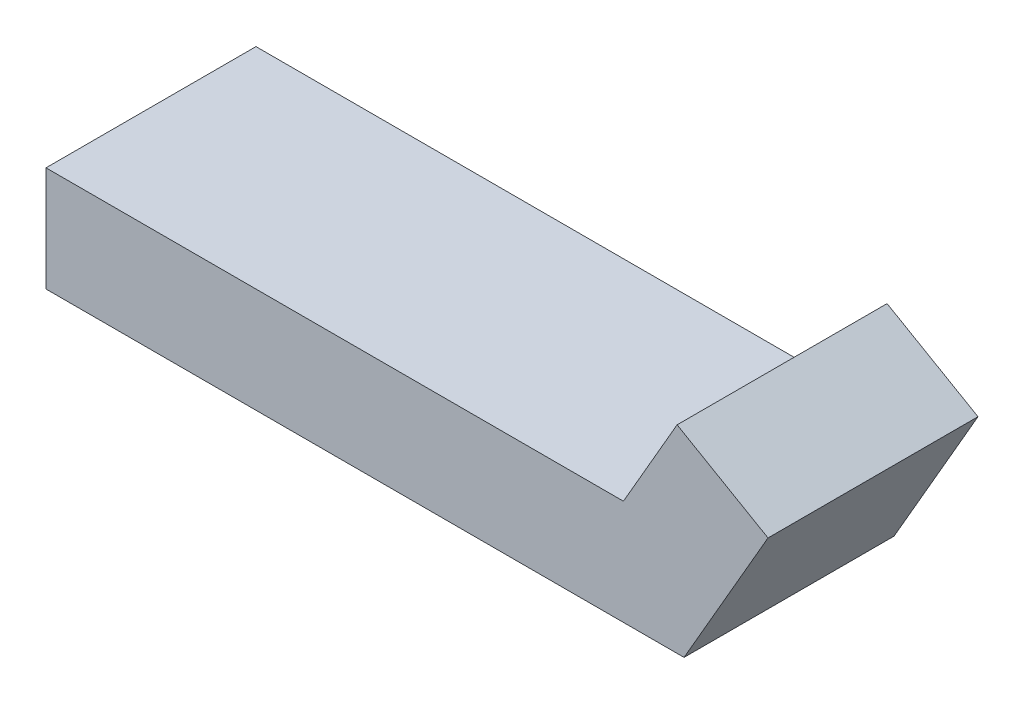
ISO-10303-21;
HEADER;
FILE_DESCRIPTION(('STEP AP214'),'2;1');
FILE_NAME('part.step','',(''),(''),'','','');
FILE_SCHEMA(('AUTOMOTIVE_DESIGN { 1 0 10303 214 1 1 1 1 }'));
ENDSEC;
DATA;
#1=APPLICATION_CONTEXT('core data for automotive mechanical design processes');
#2=APPLICATION_PROTOCOL_DEFINITION('international standard','automotive_design',2000,#1);
#3=PRODUCT_CONTEXT('',#1,'mechanical');
#4=PRODUCT('Part','Part','',(#3));
#5=PRODUCT_RELATED_PRODUCT_CATEGORY('part','',(#4));
#6=PRODUCT_DEFINITION_FORMATION('','',#4);
#7=PRODUCT_DEFINITION_CONTEXT('part definition',#1,'design');
#8=PRODUCT_DEFINITION('design','',#6,#7);
#9=PRODUCT_DEFINITION_SHAPE('','',#8);
#10=(LENGTH_UNIT() NAMED_UNIT(*) SI_UNIT(.MILLI.,.METRE.));
#11=(NAMED_UNIT(*) PLANE_ANGLE_UNIT() SI_UNIT($,.RADIAN.));
#12=(NAMED_UNIT(*) SI_UNIT($,.STERADIAN.) SOLID_ANGLE_UNIT());
#13=UNCERTAINTY_MEASURE_WITH_UNIT(LENGTH_MEASURE(1.E-05),#10,'distance_accuracy_value','');
#14=(GEOMETRIC_REPRESENTATION_CONTEXT(3) GLOBAL_UNCERTAINTY_ASSIGNED_CONTEXT((#13)) GLOBAL_UNIT_ASSIGNED_CONTEXT((#10,
#11,#12)) REPRESENTATION_CONTEXT('',''));
#15=CARTESIAN_POINT('',(0.,0.,0.));
#16=DIRECTION('',(0.,0.,1.));
#17=DIRECTION('',(1.,0.,0.));
#18=AXIS2_PLACEMENT_3D('',#15,#16,#17);
#19=CARTESIAN_POINT('',(-21.7443170778437,-0.530918019351069,12.7));
#20=DIRECTION('',(1.,0.,0.));
#21=DIRECTION('',(0.,0.,-1.));
#22=AXIS2_PLACEMENT_3D('',#19,#20,#21);
#23=PLANE('',#22);
#24=DIRECTION('',(0.,-1.,0.));
#25=VECTOR('',#24,1.);
#26=CARTESIAN_POINT('',(-21.7443170778437,-0.530918019351069,0.));
#27=LINE('',#26,#25);
#28=CARTESIAN_POINT('',(-21.7443170778437,5.81908198064893,0.));
#29=VERTEX_POINT('',#28);
#30=CARTESIAN_POINT('',(-21.7443170778437,-0.530918019351069,0.));
#31=VERTEX_POINT('',#30);
#32=EDGE_CURVE('E128',#29,#31,#27,.T.);
#33=ORIENTED_EDGE('',*,*,#32,.T.);
#34=DIRECTION('',(0.,0.,-1.));
#35=VECTOR('',#34,1.);
#36=CARTESIAN_POINT('',(-21.7443170778437,-0.530918019351069,12.7));
#37=LINE('',#36,#35);
#38=CARTESIAN_POINT('',(-21.7443170778437,-0.530918019351069,12.7));
#39=VERTEX_POINT('',#38);
#40=EDGE_CURVE('E11',#39,#31,#37,.T.);
#41=ORIENTED_EDGE('',*,*,#40,.F.);
#42=DIRECTION('',(0.,-1.,0.));
#43=VECTOR('',#42,1.);
#44=CARTESIAN_POINT('',(-21.7443170778437,-0.530918019351069,12.7));
#45=LINE('',#44,#43);
#46=CARTESIAN_POINT('',(-21.7443170778437,5.81908198064893,12.7));
#47=VERTEX_POINT('',#46);
#48=EDGE_CURVE('E144',#47,#39,#45,.T.);
#49=ORIENTED_EDGE('',*,*,#48,.F.);
#50=DIRECTION('',(0.,0.,-1.));
#51=VECTOR('',#50,1.);
#52=CARTESIAN_POINT('',(-21.7443170778437,5.81908198064893,12.7));
#53=LINE('',#52,#51);
#54=EDGE_CURVE('E124',#47,#29,#53,.T.);
#55=ORIENTED_EDGE('',*,*,#54,.T.);
#56=EDGE_LOOP('',(#33,#41,#49,#55));
#57=FACE_BOUND('',#56,.T.);
#58=ADVANCED_FACE('F39',(#57),#23,.F.);
#59=CARTESIAN_POINT('',(16.8468571315105,-0.530918019351043,12.7));
#60=DIRECTION('',(0.,1.,0.));
#61=DIRECTION('',(-1.,0.,0.));
#62=AXIS2_PLACEMENT_3D('',#59,#60,#61);
#63=PLANE('',#62);
#64=DIRECTION('',(1.,0.,0.));
#65=VECTOR('',#64,1.);
#66=CARTESIAN_POINT('',(16.8468571315105,-0.530918019351043,0.));
#67=LINE('',#66,#65);
#68=CARTESIAN_POINT('',(16.8468571315105,-0.530918019351043,0.));
#69=VERTEX_POINT('',#68);
#70=EDGE_CURVE('E132',#31,#69,#67,.T.);
#71=ORIENTED_EDGE('',*,*,#70,.T.);
#72=DIRECTION('',(0.,0.,-1.));
#73=VECTOR('',#72,1.);
#74=CARTESIAN_POINT('',(16.8468571315105,-0.530918019351043,12.7));
#75=LINE('',#74,#73);
#76=CARTESIAN_POINT('',(16.8468571315105,-0.530918019351043,12.7));
#77=VERTEX_POINT('',#76);
#78=EDGE_CURVE('E48',#77,#69,#75,.T.);
#79=ORIENTED_EDGE('',*,*,#78,.F.);
#80=DIRECTION('',(1.,0.,0.));
#81=VECTOR('',#80,1.);
#82=CARTESIAN_POINT('',(16.8468571315105,-0.530918019351043,12.7));
#83=LINE('',#82,#81);
#84=EDGE_CURVE('E93',#39,#77,#83,.T.);
#85=ORIENTED_EDGE('',*,*,#84,.F.);
#86=ORIENTED_EDGE('',*,*,#40,.T.);
#87=EDGE_LOOP('',(#71,#79,#85,#86));
#88=FACE_BOUND('',#87,.T.);
#89=ADVANCED_FACE('F172',(#88),#63,.F.);
#90=CARTESIAN_POINT('',(21.9268571315104,8.26790008309887,12.7));
#91=DIRECTION('',(-0.86602540378444,0.499999999999998,0.));
#92=DIRECTION('',(-0.499999999999998,-0.86602540378444,0.));
#93=AXIS2_PLACEMENT_3D('',#90,#91,#92);
#94=PLANE('',#93);
#95=DIRECTION('',(0.499999999999998,0.86602540378444,0.));
#96=VECTOR('',#95,1.);
#97=CARTESIAN_POINT('',(21.9268571315104,8.26790008309887,0.));
#98=LINE('',#97,#96);
#99=CARTESIAN_POINT('',(21.9268571315104,8.26790008309887,0.));
#100=VERTEX_POINT('',#99);
#101=EDGE_CURVE('E135',#69,#100,#98,.T.);
#102=ORIENTED_EDGE('',*,*,#101,.T.);
#103=DIRECTION('',(0.,0.,-1.));
#104=VECTOR('',#103,1.);
#105=CARTESIAN_POINT('',(21.9268571315104,8.26790008309887,12.7));
#106=LINE('',#105,#104);
#107=CARTESIAN_POINT('',(21.9268571315104,8.26790008309887,12.7));
#108=VERTEX_POINT('',#107);
#109=EDGE_CURVE('E117',#108,#100,#106,.T.);
#110=ORIENTED_EDGE('',*,*,#109,.F.);
#111=DIRECTION('',(0.499999999999998,0.86602540378444,0.));
#112=VECTOR('',#111,1.);
#113=CARTESIAN_POINT('',(21.9268571315104,8.26790008309887,12.7));
#114=LINE('',#113,#112);
#115=EDGE_CURVE('E106',#77,#108,#114,.T.);
#116=ORIENTED_EDGE('',*,*,#115,.F.);
#117=ORIENTED_EDGE('',*,*,#78,.T.);
#118=EDGE_LOOP('',(#102,#110,#116,#117));
#119=FACE_BOUND('',#118,.T.);
#120=ADVANCED_FACE('F154',(#119),#94,.F.);
#121=CARTESIAN_POINT('',(16.4275958174792,11.4429000830988,12.7));
#122=DIRECTION('',(-0.499999999999989,-0.866025403784445,0.));
#123=DIRECTION('',(0.866025403784445,-0.49999999999999,0.));
#124=AXIS2_PLACEMENT_3D('',#121,#122,#123);
#125=PLANE('',#124);
#126=DIRECTION('',(-0.866025403784445,0.499999999999989,0.));
#127=VECTOR('',#126,1.);
#128=CARTESIAN_POINT('',(16.4275958174792,11.4429000830988,0.));
#129=LINE('',#128,#127);
#130=CARTESIAN_POINT('',(16.4275958174792,11.4429000830988,0.));
#131=VERTEX_POINT('',#130);
#132=EDGE_CURVE('E115',#100,#131,#129,.T.);
#133=ORIENTED_EDGE('',*,*,#132,.T.);
#134=DIRECTION('',(0.,0.,-1.));
#135=VECTOR('',#134,1.);
#136=CARTESIAN_POINT('',(16.4275958174792,11.4429000830988,12.7));
#137=LINE('',#136,#135);
#138=CARTESIAN_POINT('',(16.4275958174792,11.4429000830988,12.7));
#139=VERTEX_POINT('',#138);
#140=EDGE_CURVE('E112',#139,#131,#137,.T.);
#141=ORIENTED_EDGE('',*,*,#140,.F.);
#142=DIRECTION('',(-0.866025403784445,0.499999999999989,0.));
#143=VECTOR('',#142,1.);
#144=CARTESIAN_POINT('',(16.4275958174792,11.4429000830988,12.7));
#145=LINE('',#144,#143);
#146=EDGE_CURVE('E100',#108,#139,#145,.T.);
#147=ORIENTED_EDGE('',*,*,#146,.F.);
#148=ORIENTED_EDGE('',*,*,#109,.T.);
#149=EDGE_LOOP('',(#133,#141,#147,#148));
#150=FACE_BOUND('',#149,.T.);
#151=ADVANCED_FACE('F113',(#150),#125,.F.);
#152=CARTESIAN_POINT('',(13.1806829221563,5.81908198064893,12.7));
#153=DIRECTION('',(0.86602540378444,-0.499999999999998,0.));
#154=DIRECTION('',(0.499999999999998,0.86602540378444,0.));
#155=AXIS2_PLACEMENT_3D('',#152,#153,#154);
#156=PLANE('',#155);
#157=DIRECTION('',(-0.499999999999998,-0.86602540378444,0.));
#158=VECTOR('',#157,1.);
#159=CARTESIAN_POINT('',(13.1806829221563,5.81908198064893,0.));
#160=LINE('',#159,#158);
#161=CARTESIAN_POINT('',(13.1806829221563,5.81908198064893,0.));
#162=VERTEX_POINT('',#161);
#163=EDGE_CURVE('E79',#131,#162,#160,.T.);
#164=ORIENTED_EDGE('',*,*,#163,.T.);
#165=DIRECTION('',(0.,0.,-1.));
#166=VECTOR('',#165,1.);
#167=CARTESIAN_POINT('',(13.1806829221563,5.81908198064893,12.7));
#168=LINE('',#167,#166);
#169=CARTESIAN_POINT('',(13.1806829221563,5.81908198064893,12.7));
#170=VERTEX_POINT('',#169);
#171=EDGE_CURVE('E118',#170,#162,#168,.T.);
#172=ORIENTED_EDGE('',*,*,#171,.F.);
#173=DIRECTION('',(-0.499999999999998,-0.86602540378444,0.));
#174=VECTOR('',#173,1.);
#175=CARTESIAN_POINT('',(13.1806829221563,5.81908198064893,12.7));
#176=LINE('',#175,#174);
#177=EDGE_CURVE('E104',#139,#170,#176,.T.);
#178=ORIENTED_EDGE('',*,*,#177,.F.);
#179=ORIENTED_EDGE('',*,*,#140,.T.);
#180=EDGE_LOOP('',(#164,#172,#178,#179));
#181=FACE_BOUND('',#180,.T.);
#182=ADVANCED_FACE('F120',(#181),#156,.F.);
#183=CARTESIAN_POINT('',(-21.7443170778437,5.81908198064893,12.7));
#184=DIRECTION('',(0.,-1.,0.));
#185=DIRECTION('',(1.,0.,0.));
#186=AXIS2_PLACEMENT_3D('',#183,#184,#185);
#187=PLANE('',#186);
#188=DIRECTION('',(-1.,0.,0.));
#189=VECTOR('',#188,1.);
#190=CARTESIAN_POINT('',(-21.7443170778437,5.81908198064893,0.));
#191=LINE('',#190,#189);
#192=EDGE_CURVE('E85',#162,#29,#191,.T.);
#193=ORIENTED_EDGE('',*,*,#192,.T.);
#194=ORIENTED_EDGE('',*,*,#54,.F.);
#195=DIRECTION('',(-1.,0.,0.));
#196=VECTOR('',#195,1.);
#197=CARTESIAN_POINT('',(-21.7443170778437,5.81908198064893,12.7));
#198=LINE('',#197,#196);
#199=EDGE_CURVE('E56',#170,#47,#198,.T.);
#200=ORIENTED_EDGE('',*,*,#199,.F.);
#201=ORIENTED_EDGE('',*,*,#171,.T.);
#202=EDGE_LOOP('',(#193,#194,#200,#201));
#203=FACE_BOUND('',#202,.T.);
#204=ADVANCED_FACE('F161',(#203),#187,.F.);
#205=CARTESIAN_POINT('',(0.,0.,12.7));
#206=DIRECTION('',(0.,0.,-1.));
#207=DIRECTION('',(-1.,0.,0.));
#208=AXIS2_PLACEMENT_3D('',#205,#206,#207);
#209=PLANE('',#208);
#210=ORIENTED_EDGE('',*,*,#48,.T.);
#211=ORIENTED_EDGE('',*,*,#84,.T.);
#212=ORIENTED_EDGE('',*,*,#115,.T.);
#213=ORIENTED_EDGE('',*,*,#146,.T.);
#214=ORIENTED_EDGE('',*,*,#177,.T.);
#215=ORIENTED_EDGE('',*,*,#199,.T.);
#216=EDGE_LOOP('',(#210,#211,#212,#213,#214,#215));
#217=FACE_BOUND('',#216,.T.);
#218=ADVANCED_FACE('F102',(#217),#209,.F.);
#219=CARTESIAN_POINT('',(0.,0.,0.));
#220=DIRECTION('',(0.,0.,-1.));
#221=DIRECTION('',(-1.,0.,0.));
#222=AXIS2_PLACEMENT_3D('',#219,#220,#221);
#223=PLANE('',#222);
#224=ORIENTED_EDGE('',*,*,#32,.F.);
#225=ORIENTED_EDGE('',*,*,#192,.F.);
#226=ORIENTED_EDGE('',*,*,#163,.F.);
#227=ORIENTED_EDGE('',*,*,#132,.F.);
#228=ORIENTED_EDGE('',*,*,#101,.F.);
#229=ORIENTED_EDGE('',*,*,#70,.F.);
#230=EDGE_LOOP('',(#224,#225,#226,#227,#228,#229));
#231=FACE_BOUND('',#230,.T.);
#232=ADVANCED_FACE('F157',(#231),#223,.T.);
#233=CLOSED_SHELL('',(#58,#89,#120,#151,#182,#204,#218,#232));
#234=MANIFOLD_SOLID_BREP('B2',#233);
#235=ADVANCED_BREP_SHAPE_REPRESENTATION('',(#18,#234),#14);
#236=SHAPE_DEFINITION_REPRESENTATION(#9,#235);
ENDSEC;
END-ISO-10303-21;
